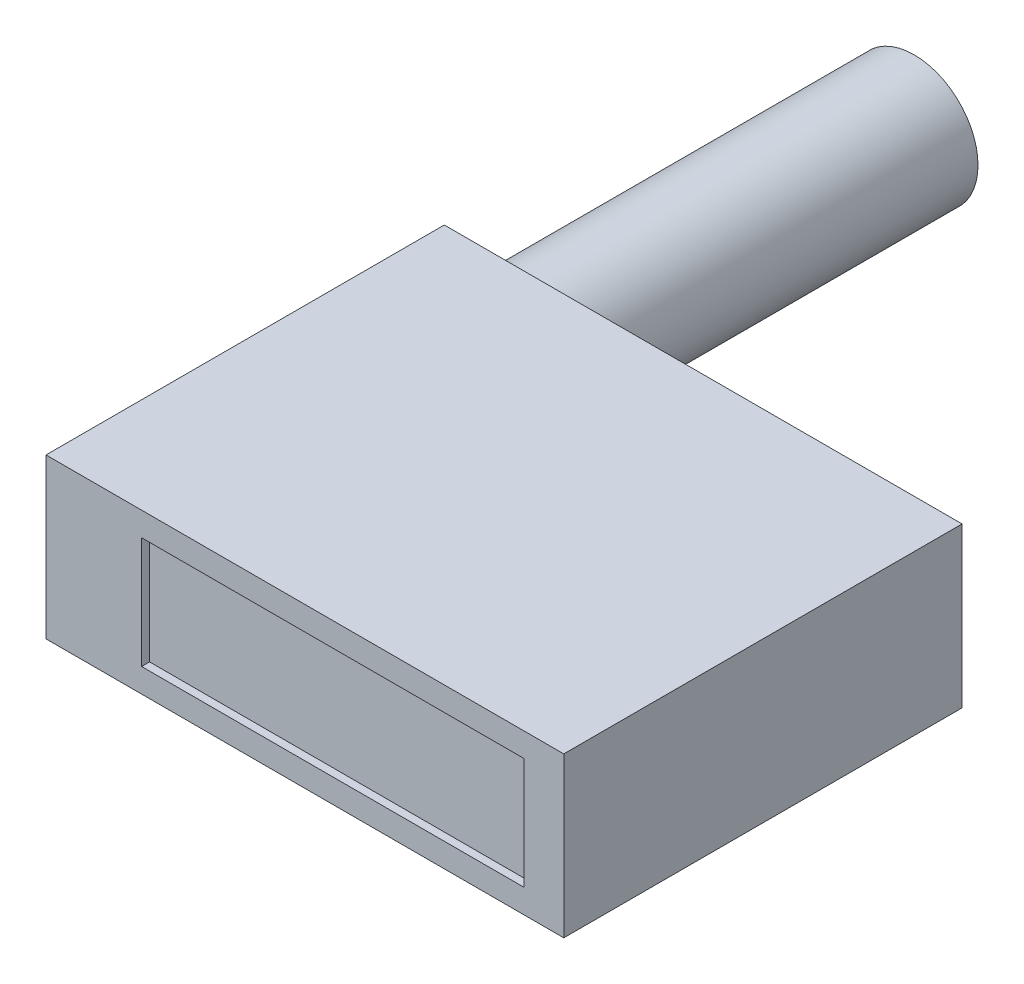
ISO-10303-21;
HEADER;
FILE_DESCRIPTION(('STEP AP214'),'2;1');
FILE_NAME('part.step','',(''),(''),'','','');
FILE_SCHEMA(('AUTOMOTIVE_DESIGN { 1 0 10303 214 1 1 1 1 }'));
ENDSEC;
DATA;
#1=APPLICATION_CONTEXT('core data for automotive mechanical design processes');
#2=APPLICATION_PROTOCOL_DEFINITION('international standard','automotive_design',2000,#1);
#3=PRODUCT_CONTEXT('',#1,'mechanical');
#4=PRODUCT('Part','Part','',(#3));
#5=PRODUCT_RELATED_PRODUCT_CATEGORY('part','',(#4));
#6=PRODUCT_DEFINITION_FORMATION('','',#4);
#7=PRODUCT_DEFINITION_CONTEXT('part definition',#1,'design');
#8=PRODUCT_DEFINITION('design','',#6,#7);
#9=PRODUCT_DEFINITION_SHAPE('','',#8);
#10=(LENGTH_UNIT() NAMED_UNIT(*) SI_UNIT(.MILLI.,.METRE.));
#11=(NAMED_UNIT(*) PLANE_ANGLE_UNIT() SI_UNIT($,.RADIAN.));
#12=(NAMED_UNIT(*) SI_UNIT($,.STERADIAN.) SOLID_ANGLE_UNIT());
#13=UNCERTAINTY_MEASURE_WITH_UNIT(LENGTH_MEASURE(1.E-05),#10,'distance_accuracy_value','');
#14=(GEOMETRIC_REPRESENTATION_CONTEXT(3) GLOBAL_UNCERTAINTY_ASSIGNED_CONTEXT((#13)) GLOBAL_UNIT_ASSIGNED_CONTEXT((#10,
#11,#12)) REPRESENTATION_CONTEXT('',''));
#15=CARTESIAN_POINT('',(0.,0.,0.));
#16=DIRECTION('',(0.,0.,1.));
#17=DIRECTION('',(1.,0.,0.));
#18=AXIS2_PLACEMENT_3D('',#15,#16,#17);
#19=CARTESIAN_POINT('',(32.5,20.,-25.));
#20=DIRECTION('',(-1.,0.,0.));
#21=DIRECTION('',(0.,0.,1.));
#22=AXIS2_PLACEMENT_3D('',#19,#20,#21);
#23=PLANE('',#22);
#24=DIRECTION('',(0.,0.,-1.));
#25=VECTOR('',#24,1.);
#26=CARTESIAN_POINT('',(32.5,0.,-25.));
#27=LINE('',#26,#25);
#28=CARTESIAN_POINT('',(32.5,0.,25.));
#29=VERTEX_POINT('',#28);
#30=CARTESIAN_POINT('',(32.5,0.,-25.));
#31=VERTEX_POINT('',#30);
#32=EDGE_CURVE('E150',#29,#31,#27,.T.);
#33=ORIENTED_EDGE('',*,*,#32,.T.);
#34=DIRECTION('',(0.,-1.,0.));
#35=VECTOR('',#34,1.);
#36=CARTESIAN_POINT('',(32.5,20.,-25.));
#37=LINE('',#36,#35);
#38=CARTESIAN_POINT('',(32.5,20.,-25.));
#39=VERTEX_POINT('',#38);
#40=EDGE_CURVE('E46',#39,#31,#37,.T.);
#41=ORIENTED_EDGE('',*,*,#40,.F.);
#42=DIRECTION('',(0.,0.,-1.));
#43=VECTOR('',#42,1.);
#44=CARTESIAN_POINT('',(32.5,20.,-25.));
#45=LINE('',#44,#43);
#46=CARTESIAN_POINT('',(32.5,20.,25.));
#47=VERTEX_POINT('',#46);
#48=EDGE_CURVE('E154',#47,#39,#45,.T.);
#49=ORIENTED_EDGE('',*,*,#48,.F.);
#50=DIRECTION('',(0.,-1.,0.));
#51=VECTOR('',#50,1.);
#52=CARTESIAN_POINT('',(32.5,20.,25.));
#53=LINE('',#52,#51);
#54=EDGE_CURVE('E160',#47,#29,#53,.T.);
#55=ORIENTED_EDGE('',*,*,#54,.T.);
#56=EDGE_LOOP('',(#33,#41,#49,#55));
#57=FACE_BOUND('',#56,.T.);
#58=ADVANCED_FACE('F39',(#57),#23,.F.);
#59=CARTESIAN_POINT('',(-32.5,20.,-25.));
#60=DIRECTION('',(0.,0.,1.));
#61=DIRECTION('',(1.,0.,0.));
#62=AXIS2_PLACEMENT_3D('',#59,#60,#61);
#63=PLANE('',#62);
#64=CARTESIAN_POINT('',(-23.5,10.,-25.));
#65=DIRECTION('',(0.,0.,1.));
#66=DIRECTION('',(1.,0.,0.));
#67=AXIS2_PLACEMENT_3D('',#64,#65,#66);
#68=CIRCLE('',#67,8.);
#69=CARTESIAN_POINT('',(-15.5,10.,-25.));
#70=VERTEX_POINT('',#69);
#71=EDGE_CURVE('E11',#70,#70,#68,.F.);
#72=ORIENTED_EDGE('',*,*,#71,.F.);
#73=EDGE_LOOP('',(#72));
#74=FACE_BOUND('',#73,.T.);
#75=DIRECTION('',(-1.,0.,0.));
#76=VECTOR('',#75,1.);
#77=CARTESIAN_POINT('',(-32.5,0.,-25.));
#78=LINE('',#77,#76);
#79=CARTESIAN_POINT('',(-32.5,0.,-25.));
#80=VERTEX_POINT('',#79);
#81=EDGE_CURVE('E163',#31,#80,#78,.T.);
#82=ORIENTED_EDGE('',*,*,#81,.T.);
#83=DIRECTION('',(0.,-1.,0.));
#84=VECTOR('',#83,1.);
#85=CARTESIAN_POINT('',(-32.5,20.,-25.));
#86=LINE('',#85,#84);
#87=CARTESIAN_POINT('',(-32.5,20.,-25.));
#88=VERTEX_POINT('',#87);
#89=EDGE_CURVE('E171',#88,#80,#86,.T.);
#90=ORIENTED_EDGE('',*,*,#89,.F.);
#91=DIRECTION('',(-1.,0.,0.));
#92=VECTOR('',#91,1.);
#93=CARTESIAN_POINT('',(-32.5,20.,-25.));
#94=LINE('',#93,#92);
#95=EDGE_CURVE('E91',#39,#88,#94,.T.);
#96=ORIENTED_EDGE('',*,*,#95,.F.);
#97=ORIENTED_EDGE('',*,*,#40,.T.);
#98=EDGE_LOOP('',(#82,#90,#96,#97));
#99=FACE_BOUND('',#98,.T.);
#100=ADVANCED_FACE('F174',(#74,#99),#63,.F.);
#101=CARTESIAN_POINT('',(-32.5,20.,-25.));
#102=DIRECTION('',(1.,0.,0.));
#103=DIRECTION('',(0.,0.,-1.));
#104=AXIS2_PLACEMENT_3D('',#101,#102,#103);
#105=PLANE('',#104);
#106=DIRECTION('',(0.,0.,1.));
#107=VECTOR('',#106,1.);
#108=CARTESIAN_POINT('',(-32.5,0.,-25.));
#109=LINE('',#108,#107);
#110=CARTESIAN_POINT('',(-32.5,0.,25.));
#111=VERTEX_POINT('',#110);
#112=EDGE_CURVE('E165',#80,#111,#109,.T.);
#113=ORIENTED_EDGE('',*,*,#112,.T.);
#114=DIRECTION('',(0.,-1.,0.));
#115=VECTOR('',#114,1.);
#116=CARTESIAN_POINT('',(-32.5,20.,25.));
#117=LINE('',#116,#115);
#118=CARTESIAN_POINT('',(-32.5,20.,25.));
#119=VERTEX_POINT('',#118);
#120=EDGE_CURVE('E169',#119,#111,#117,.T.);
#121=ORIENTED_EDGE('',*,*,#120,.F.);
#122=DIRECTION('',(0.,0.,1.));
#123=VECTOR('',#122,1.);
#124=CARTESIAN_POINT('',(-32.5,20.,-25.));
#125=LINE('',#124,#123);
#126=EDGE_CURVE('E157',#88,#119,#125,.T.);
#127=ORIENTED_EDGE('',*,*,#126,.F.);
#128=ORIENTED_EDGE('',*,*,#89,.T.);
#129=EDGE_LOOP('',(#113,#121,#127,#128));
#130=FACE_BOUND('',#129,.T.);
#131=ADVANCED_FACE('F183',(#130),#105,.F.);
#132=CARTESIAN_POINT('',(-32.5,20.,25.));
#133=DIRECTION('',(0.,0.,-1.));
#134=DIRECTION('',(-1.,0.,0.));
#135=AXIS2_PLACEMENT_3D('',#132,#133,#134);
#136=PLANE('',#135);
#137=DIRECTION('',(-1.,0.,0.));
#138=VECTOR('',#137,1.);
#139=CARTESIAN_POINT('',(-20.5,17.,25.));
#140=LINE('',#139,#138);
#141=CARTESIAN_POINT('',(27.5,17.,25.));
#142=VERTEX_POINT('',#141);
#143=CARTESIAN_POINT('',(-20.5,17.,25.));
#144=VERTEX_POINT('',#143);
#145=EDGE_CURVE('E144',#142,#144,#140,.T.);
#146=ORIENTED_EDGE('',*,*,#145,.F.);
#147=DIRECTION('',(0.,1.,0.));
#148=VECTOR('',#147,1.);
#149=CARTESIAN_POINT('',(27.5,17.,25.));
#150=LINE('',#149,#148);
#151=CARTESIAN_POINT('',(27.5,3.,25.));
#152=VERTEX_POINT('',#151);
#153=EDGE_CURVE('E53',#152,#142,#150,.T.);
#154=ORIENTED_EDGE('',*,*,#153,.F.);
#155=DIRECTION('',(1.,0.,0.));
#156=VECTOR('',#155,1.);
#157=CARTESIAN_POINT('',(-20.5,3.,25.));
#158=LINE('',#157,#156);
#159=CARTESIAN_POINT('',(-20.5,3.,25.));
#160=VERTEX_POINT('',#159);
#161=EDGE_CURVE('E133',#160,#152,#158,.T.);
#162=ORIENTED_EDGE('',*,*,#161,.F.);
#163=DIRECTION('',(0.,-1.,0.));
#164=VECTOR('',#163,1.);
#165=CARTESIAN_POINT('',(-20.5,17.,25.));
#166=LINE('',#165,#164);
#167=EDGE_CURVE('E136',#144,#160,#166,.T.);
#168=ORIENTED_EDGE('',*,*,#167,.F.);
#169=EDGE_LOOP('',(#146,#154,#162,#168));
#170=FACE_BOUND('',#169,.T.);
#171=DIRECTION('',(1.,0.,0.));
#172=VECTOR('',#171,1.);
#173=CARTESIAN_POINT('',(-32.5,0.,25.));
#174=LINE('',#173,#172);
#175=EDGE_CURVE('E83',#111,#29,#174,.T.);
#176=ORIENTED_EDGE('',*,*,#175,.T.);
#177=ORIENTED_EDGE('',*,*,#54,.F.);
#178=DIRECTION('',(1.,0.,0.));
#179=VECTOR('',#178,1.);
#180=CARTESIAN_POINT('',(-32.5,20.,25.));
#181=LINE('',#180,#179);
#182=EDGE_CURVE('E62',#119,#47,#181,.T.);
#183=ORIENTED_EDGE('',*,*,#182,.F.);
#184=ORIENTED_EDGE('',*,*,#120,.T.);
#185=EDGE_LOOP('',(#176,#177,#183,#184));
#186=FACE_BOUND('',#185,.T.);
#187=ADVANCED_FACE('F185',(#170,#186),#136,.F.);
#188=CARTESIAN_POINT('',(0.,20.,0.));
#189=DIRECTION('',(0.,1.,0.));
#190=DIRECTION('',(0.,0.,1.));
#191=AXIS2_PLACEMENT_3D('',#188,#189,#190);
#192=PLANE('',#191);
#193=ORIENTED_EDGE('',*,*,#48,.T.);
#194=ORIENTED_EDGE('',*,*,#95,.T.);
#195=ORIENTED_EDGE('',*,*,#126,.T.);
#196=ORIENTED_EDGE('',*,*,#182,.T.);
#197=EDGE_LOOP('',(#193,#194,#195,#196));
#198=FACE_BOUND('',#197,.T.);
#199=ADVANCED_FACE('F186',(#198),#192,.T.);
#200=CARTESIAN_POINT('',(0.,0.,0.));
#201=DIRECTION('',(0.,1.,0.));
#202=DIRECTION('',(0.,0.,1.));
#203=AXIS2_PLACEMENT_3D('',#200,#201,#202);
#204=PLANE('',#203);
#205=ORIENTED_EDGE('',*,*,#32,.F.);
#206=ORIENTED_EDGE('',*,*,#175,.F.);
#207=ORIENTED_EDGE('',*,*,#112,.F.);
#208=ORIENTED_EDGE('',*,*,#81,.F.);
#209=EDGE_LOOP('',(#205,#206,#207,#208));
#210=FACE_BOUND('',#209,.T.);
#211=ADVANCED_FACE('F179',(#210),#204,.F.);
#212=CARTESIAN_POINT('',(27.5,17.,24.));
#213=DIRECTION('',(1.,0.,0.));
#214=DIRECTION('',(0.,0.,-1.));
#215=AXIS2_PLACEMENT_3D('',#212,#213,#214);
#216=PLANE('',#215);
#217=ORIENTED_EDGE('',*,*,#153,.T.);
#218=DIRECTION('',(0.,0.,1.));
#219=VECTOR('',#218,1.);
#220=CARTESIAN_POINT('',(27.5,17.,24.));
#221=LINE('',#220,#219);
#222=CARTESIAN_POINT('',(27.5,17.,24.));
#223=VERTEX_POINT('',#222);
#224=EDGE_CURVE('E111',#223,#142,#221,.T.);
#225=ORIENTED_EDGE('',*,*,#224,.F.);
#226=DIRECTION('',(0.,1.,0.));
#227=VECTOR('',#226,1.);
#228=CARTESIAN_POINT('',(27.5,17.,24.));
#229=LINE('',#228,#227);
#230=CARTESIAN_POINT('',(27.5,3.,24.));
#231=VERTEX_POINT('',#230);
#232=EDGE_CURVE('E115',#231,#223,#229,.T.);
#233=ORIENTED_EDGE('',*,*,#232,.F.);
#234=DIRECTION('',(0.,0.,1.));
#235=VECTOR('',#234,1.);
#236=CARTESIAN_POINT('',(27.5,3.,24.));
#237=LINE('',#236,#235);
#238=EDGE_CURVE('E148',#231,#152,#237,.T.);
#239=ORIENTED_EDGE('',*,*,#238,.T.);
#240=EDGE_LOOP('',(#217,#225,#233,#239));
#241=FACE_BOUND('',#240,.T.);
#242=ADVANCED_FACE('F113',(#241),#216,.F.);
#243=CARTESIAN_POINT('',(-20.5,3.,24.));
#244=DIRECTION('',(0.,-1.,0.));
#245=DIRECTION('',(0.,0.,-1.));
#246=AXIS2_PLACEMENT_3D('',#243,#244,#245);
#247=PLANE('',#246);
#248=ORIENTED_EDGE('',*,*,#161,.T.);
#249=ORIENTED_EDGE('',*,*,#238,.F.);
#250=DIRECTION('',(1.,0.,0.));
#251=VECTOR('',#250,1.);
#252=CARTESIAN_POINT('',(-20.5,3.,24.));
#253=LINE('',#252,#251);
#254=CARTESIAN_POINT('',(-20.5,3.,24.));
#255=VERTEX_POINT('',#254);
#256=EDGE_CURVE('E121',#255,#231,#253,.T.);
#257=ORIENTED_EDGE('',*,*,#256,.F.);
#258=DIRECTION('',(0.,0.,1.));
#259=VECTOR('',#258,1.);
#260=CARTESIAN_POINT('',(-20.5,3.,24.));
#261=LINE('',#260,#259);
#262=EDGE_CURVE('E151',#255,#160,#261,.T.);
#263=ORIENTED_EDGE('',*,*,#262,.T.);
#264=EDGE_LOOP('',(#248,#249,#257,#263));
#265=FACE_BOUND('',#264,.T.);
#266=ADVANCED_FACE('F222',(#265),#247,.F.);
#267=CARTESIAN_POINT('',(-20.5,17.,24.));
#268=DIRECTION('',(-1.,0.,0.));
#269=DIRECTION('',(0.,-1.,0.));
#270=AXIS2_PLACEMENT_3D('',#267,#268,#269);
#271=PLANE('',#270);
#272=ORIENTED_EDGE('',*,*,#167,.T.);
#273=ORIENTED_EDGE('',*,*,#262,.F.);
#274=DIRECTION('',(0.,-1.,0.));
#275=VECTOR('',#274,1.);
#276=CARTESIAN_POINT('',(-20.5,17.,24.));
#277=LINE('',#276,#275);
#278=CARTESIAN_POINT('',(-20.5,17.,24.));
#279=VERTEX_POINT('',#278);
#280=EDGE_CURVE('E129',#279,#255,#277,.T.);
#281=ORIENTED_EDGE('',*,*,#280,.F.);
#282=DIRECTION('',(0.,0.,1.));
#283=VECTOR('',#282,1.);
#284=CARTESIAN_POINT('',(-20.5,17.,24.));
#285=LINE('',#284,#283);
#286=EDGE_CURVE('E120',#279,#144,#285,.T.);
#287=ORIENTED_EDGE('',*,*,#286,.T.);
#288=EDGE_LOOP('',(#272,#273,#281,#287));
#289=FACE_BOUND('',#288,.T.);
#290=ADVANCED_FACE('F225',(#289),#271,.F.);
#291=CARTESIAN_POINT('',(-20.5,17.,24.));
#292=DIRECTION('',(0.,1.,0.));
#293=DIRECTION('',(0.,0.,1.));
#294=AXIS2_PLACEMENT_3D('',#291,#292,#293);
#295=PLANE('',#294);
#296=ORIENTED_EDGE('',*,*,#145,.T.);
#297=ORIENTED_EDGE('',*,*,#286,.F.);
#298=DIRECTION('',(-1.,0.,0.));
#299=VECTOR('',#298,1.);
#300=CARTESIAN_POINT('',(-20.5,17.,24.));
#301=LINE('',#300,#299);
#302=EDGE_CURVE('E124',#223,#279,#301,.T.);
#303=ORIENTED_EDGE('',*,*,#302,.F.);
#304=ORIENTED_EDGE('',*,*,#224,.T.);
#305=EDGE_LOOP('',(#296,#297,#303,#304));
#306=FACE_BOUND('',#305,.T.);
#307=ADVANCED_FACE('F125',(#306),#295,.F.);
#308=CARTESIAN_POINT('',(0.,0.,24.));
#309=DIRECTION('',(0.,0.,1.));
#310=DIRECTION('',(1.,0.,0.));
#311=AXIS2_PLACEMENT_3D('',#308,#309,#310);
#312=PLANE('',#311);
#313=ORIENTED_EDGE('',*,*,#232,.T.);
#314=ORIENTED_EDGE('',*,*,#302,.T.);
#315=ORIENTED_EDGE('',*,*,#280,.T.);
#316=ORIENTED_EDGE('',*,*,#256,.T.);
#317=EDGE_LOOP('',(#313,#314,#315,#316));
#318=FACE_BOUND('',#317,.T.);
#319=ADVANCED_FACE('F131',(#318),#312,.T.);
#320=CARTESIAN_POINT('',(-23.5,10.,-75.));
#321=DIRECTION('',(0.,0.,1.));
#322=DIRECTION('',(1.,0.,0.));
#323=AXIS2_PLACEMENT_3D('',#320,#321,#322);
#324=CYLINDRICAL_SURFACE('',#323,8.);
#325=CARTESIAN_POINT('',(-23.5,10.,-75.));
#326=DIRECTION('',(0.,0.,-1.));
#327=DIRECTION('',(-1.,0.,0.));
#328=AXIS2_PLACEMENT_3D('',#325,#326,#327);
#329=CIRCLE('',#328,8.);
#330=CARTESIAN_POINT('',(-31.5,10.,-75.));
#331=VERTEX_POINT('',#330);
#332=EDGE_CURVE('E139',#331,#331,#329,.T.);
#333=ORIENTED_EDGE('',*,*,#332,.F.);
#334=EDGE_LOOP('',(#333));
#335=FACE_BOUND('',#334,.T.);
#336=ORIENTED_EDGE('',*,*,#71,.T.);
#337=EDGE_LOOP('',(#336));
#338=FACE_BOUND('',#337,.T.);
#339=ADVANCED_FACE('F208',(#335,#338),#324,.T.);
#340=CARTESIAN_POINT('',(-23.5,10.,-75.));
#341=DIRECTION('',(0.,0.,-1.));
#342=DIRECTION('',(-1.,0.,0.));
#343=AXIS2_PLACEMENT_3D('',#340,#341,#342);
#344=PLANE('',#343);
#345=ORIENTED_EDGE('',*,*,#332,.T.);
#346=EDGE_LOOP('',(#345));
#347=FACE_BOUND('',#346,.T.);
#348=ADVANCED_FACE('F210',(#347),#344,.T.);
#349=CLOSED_SHELL('',(#58,#100,#131,#187,#199,#211,#242,#266,#290,#307,#319,#339,#348));
#350=MANIFOLD_SOLID_BREP('B2',#349);
#351=ADVANCED_BREP_SHAPE_REPRESENTATION('',(#18,#350),#14);
#352=SHAPE_DEFINITION_REPRESENTATION(#9,#351);
ENDSEC;
END-ISO-10303-21;
